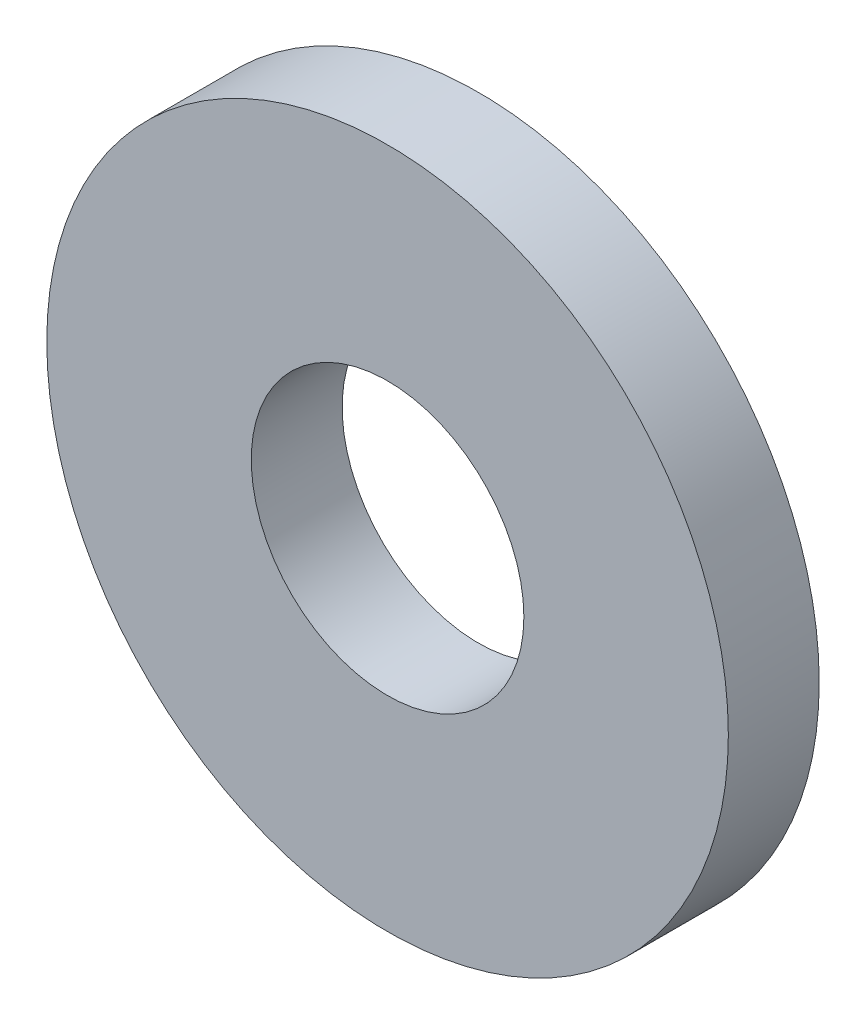
ISO-10303-21;
HEADER;
FILE_DESCRIPTION(('STEP AP214'),'2;1');
FILE_NAME('part.step','',(''),(''),'','','');
FILE_SCHEMA(('AUTOMOTIVE_DESIGN { 1 0 10303 214 1 1 1 1 }'));
ENDSEC;
DATA;
#1=APPLICATION_CONTEXT('core data for automotive mechanical design processes');
#2=APPLICATION_PROTOCOL_DEFINITION('international standard','automotive_design',2000,#1);
#3=PRODUCT_CONTEXT('',#1,'mechanical');
#4=PRODUCT('Part','Part','',(#3));
#5=PRODUCT_RELATED_PRODUCT_CATEGORY('part','',(#4));
#6=PRODUCT_DEFINITION_FORMATION('','',#4);
#7=PRODUCT_DEFINITION_CONTEXT('part definition',#1,'design');
#8=PRODUCT_DEFINITION('design','',#6,#7);
#9=PRODUCT_DEFINITION_SHAPE('','',#8);
#10=(LENGTH_UNIT() NAMED_UNIT(*) SI_UNIT(.MILLI.,.METRE.));
#11=(NAMED_UNIT(*) PLANE_ANGLE_UNIT() SI_UNIT($,.RADIAN.));
#12=(NAMED_UNIT(*) SI_UNIT($,.STERADIAN.) SOLID_ANGLE_UNIT());
#13=UNCERTAINTY_MEASURE_WITH_UNIT(LENGTH_MEASURE(1.E-05),#10,'distance_accuracy_value','');
#14=(GEOMETRIC_REPRESENTATION_CONTEXT(3) GLOBAL_UNCERTAINTY_ASSIGNED_CONTEXT((#13)) GLOBAL_UNIT_ASSIGNED_CONTEXT((#10,
#11,#12)) REPRESENTATION_CONTEXT('',''));
#15=CARTESIAN_POINT('',(0.,0.,0.));
#16=DIRECTION('',(0.,0.,1.));
#17=DIRECTION('',(1.,0.,0.));
#18=AXIS2_PLACEMENT_3D('',#15,#16,#17);
#19=CARTESIAN_POINT('',(0.,0.,1.));
#20=DIRECTION('',(0.,0.,1.));
#21=DIRECTION('',(1.,0.,0.));
#22=AXIS2_PLACEMENT_3D('',#19,#20,#21);
#23=PLANE('',#22);
#24=CARTESIAN_POINT('',(0.,0.,1.));
#25=DIRECTION('',(0.,0.,1.));
#26=DIRECTION('',(1.,0.,0.));
#27=AXIS2_PLACEMENT_3D('',#24,#25,#26);
#28=CIRCLE('',#27,3.75);
#29=CARTESIAN_POINT('',(3.75,0.,1.));
#30=VERTEX_POINT('',#29);
#31=EDGE_CURVE('E10',#30,#30,#28,.T.);
#32=ORIENTED_EDGE('',*,*,#31,.T.);
#33=EDGE_LOOP('',(#32));
#34=FACE_BOUND('',#33,.T.);
#35=CARTESIAN_POINT('',(0.,0.,1.));
#36=DIRECTION('',(0.,0.,1.));
#37=DIRECTION('',(1.,0.,0.));
#38=AXIS2_PLACEMENT_3D('',#35,#36,#37);
#39=CIRCLE('',#38,1.5);
#40=CARTESIAN_POINT('',(1.5,0.,1.));
#41=VERTEX_POINT('',#40);
#42=EDGE_CURVE('E35',#41,#41,#39,.T.);
#43=ORIENTED_EDGE('',*,*,#42,.F.);
#44=EDGE_LOOP('',(#43));
#45=FACE_BOUND('',#44,.T.);
#46=ADVANCED_FACE('F24',(#34,#45),#23,.T.);
#47=CARTESIAN_POINT('',(0.,0.,0.));
#48=DIRECTION('',(0.,0.,1.));
#49=DIRECTION('',(1.,0.,0.));
#50=AXIS2_PLACEMENT_3D('',#47,#48,#49);
#51=PLANE('',#50);
#52=CARTESIAN_POINT('',(0.,0.,0.));
#53=DIRECTION('',(0.,0.,1.));
#54=DIRECTION('',(1.,0.,0.));
#55=AXIS2_PLACEMENT_3D('',#52,#53,#54);
#56=CIRCLE('',#55,3.75);
#57=CARTESIAN_POINT('',(3.75,0.,0.));
#58=VERTEX_POINT('',#57);
#59=EDGE_CURVE('E31',#58,#58,#56,.T.);
#60=ORIENTED_EDGE('',*,*,#59,.F.);
#61=EDGE_LOOP('',(#60));
#62=FACE_BOUND('',#61,.T.);
#63=CARTESIAN_POINT('',(0.,0.,0.));
#64=DIRECTION('',(0.,0.,1.));
#65=DIRECTION('',(1.,0.,0.));
#66=AXIS2_PLACEMENT_3D('',#63,#64,#65);
#67=CIRCLE('',#66,1.5);
#68=CARTESIAN_POINT('',(1.5,0.,0.));
#69=VERTEX_POINT('',#68);
#70=EDGE_CURVE('E39',#69,#69,#67,.T.);
#71=ORIENTED_EDGE('',*,*,#70,.T.);
#72=EDGE_LOOP('',(#71));
#73=FACE_BOUND('',#72,.T.);
#74=ADVANCED_FACE('F45',(#62,#73),#51,.F.);
#75=CARTESIAN_POINT('',(0.,0.,1.));
#76=DIRECTION('',(0.,0.,-1.));
#77=DIRECTION('',(-1.,0.,0.));
#78=AXIS2_PLACEMENT_3D('',#75,#76,#77);
#79=CYLINDRICAL_SURFACE('',#78,3.75);
#80=ORIENTED_EDGE('',*,*,#31,.F.);
#81=EDGE_LOOP('',(#80));
#82=FACE_BOUND('',#81,.T.);
#83=ORIENTED_EDGE('',*,*,#59,.T.);
#84=EDGE_LOOP('',(#83));
#85=FACE_BOUND('',#84,.T.);
#86=ADVANCED_FACE('F26',(#82,#85),#79,.T.);
#87=CARTESIAN_POINT('',(0.,0.,1.));
#88=DIRECTION('',(0.,0.,-1.));
#89=DIRECTION('',(-1.,0.,0.));
#90=AXIS2_PLACEMENT_3D('',#87,#88,#89);
#91=CYLINDRICAL_SURFACE('',#90,1.5);
#92=ORIENTED_EDGE('',*,*,#42,.T.);
#93=EDGE_LOOP('',(#92));
#94=FACE_BOUND('',#93,.T.);
#95=ORIENTED_EDGE('',*,*,#70,.F.);
#96=EDGE_LOOP('',(#95));
#97=FACE_BOUND('',#96,.T.);
#98=ADVANCED_FACE('F47',(#94,#97),#91,.F.);
#99=CLOSED_SHELL('',(#46,#74,#86,#98));
#100=MANIFOLD_SOLID_BREP('B2',#99);
#101=ADVANCED_BREP_SHAPE_REPRESENTATION('',(#18,#100),#14);
#102=SHAPE_DEFINITION_REPRESENTATION(#9,#101);
ENDSEC;
END-ISO-10303-21;
